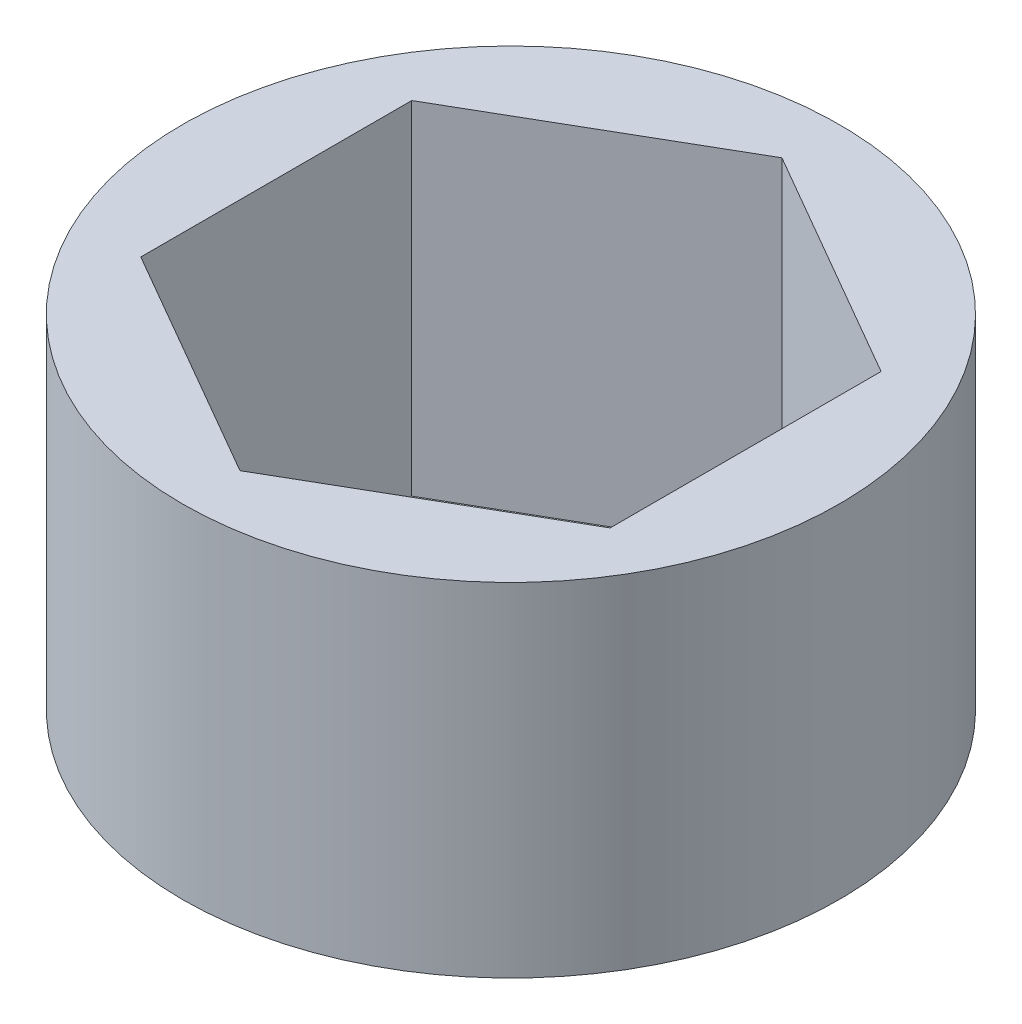
ISO-10303-21;
HEADER;
FILE_DESCRIPTION(('STEP AP214'),'2;1');
FILE_NAME('part.step','',(''),(''),'','','');
FILE_SCHEMA(('AUTOMOTIVE_DESIGN { 1 0 10303 214 1 1 1 1 }'));
ENDSEC;
DATA;
#1=APPLICATION_CONTEXT('core data for automotive mechanical design processes');
#2=APPLICATION_PROTOCOL_DEFINITION('international standard','automotive_design',2000,#1);
#3=PRODUCT_CONTEXT('',#1,'mechanical');
#4=PRODUCT('Part','Part','',(#3));
#5=PRODUCT_RELATED_PRODUCT_CATEGORY('part','',(#4));
#6=PRODUCT_DEFINITION_FORMATION('','',#4);
#7=PRODUCT_DEFINITION_CONTEXT('part definition',#1,'design');
#8=PRODUCT_DEFINITION('design','',#6,#7);
#9=PRODUCT_DEFINITION_SHAPE('','',#8);
#10=(LENGTH_UNIT() NAMED_UNIT(*) SI_UNIT(.MILLI.,.METRE.));
#11=(NAMED_UNIT(*) PLANE_ANGLE_UNIT() SI_UNIT($,.RADIAN.));
#12=(NAMED_UNIT(*) SI_UNIT($,.STERADIAN.) SOLID_ANGLE_UNIT());
#13=UNCERTAINTY_MEASURE_WITH_UNIT(LENGTH_MEASURE(1.E-05),#10,'distance_accuracy_value','');
#14=(GEOMETRIC_REPRESENTATION_CONTEXT(3) GLOBAL_UNCERTAINTY_ASSIGNED_CONTEXT((#13)) GLOBAL_UNIT_ASSIGNED_CONTEXT((#10,
#11,#12)) REPRESENTATION_CONTEXT('',''));
#15=CARTESIAN_POINT('',(0.,0.,0.));
#16=DIRECTION('',(0.,0.,1.));
#17=DIRECTION('',(1.,0.,0.));
#18=AXIS2_PLACEMENT_3D('',#15,#16,#17);
#19=CARTESIAN_POINT('',(0.,4.6355,0.));
#20=DIRECTION('',(0.,1.,0.));
#21=DIRECTION('',(0.,0.,1.));
#22=AXIS2_PLACEMENT_3D('',#19,#20,#21);
#23=PLANE('',#22);
#24=CARTESIAN_POINT('',(0.,4.6355,0.));
#25=DIRECTION('',(0.,1.,0.));
#26=DIRECTION('',(0.,0.,1.));
#27=AXIS2_PLACEMENT_3D('',#24,#25,#26);
#28=CIRCLE('',#27,8.89);
#29=CARTESIAN_POINT('',(0.,4.6355,8.89));
#30=VERTEX_POINT('',#29);
#31=EDGE_CURVE('E11',#30,#30,#28,.T.);
#32=ORIENTED_EDGE('',*,*,#31,.T.);
#33=EDGE_LOOP('',(#32));
#34=FACE_BOUND('',#33,.T.);
#35=DIRECTION('',(-0.866025403784439,0.,0.5));
#36=VECTOR('',#35,1.);
#37=CARTESIAN_POINT('',(0.,4.6355,-7.33234841870824));
#38=LINE('',#37,#36);
#39=CARTESIAN_POINT('',(0.,4.6355,-7.33234841870824));
#40=VERTEX_POINT('',#39);
#41=CARTESIAN_POINT('',(-6.35,4.6355,-3.66617420935412));
#42=VERTEX_POINT('',#41);
#43=EDGE_CURVE('E108',#40,#42,#38,.T.);
#44=ORIENTED_EDGE('',*,*,#43,.F.);
#45=DIRECTION('',(-0.866025403784439,0.,-0.5));
#46=VECTOR('',#45,1.);
#47=CARTESIAN_POINT('',(6.35,4.6355,-3.66617420935412));
#48=LINE('',#47,#46);
#49=CARTESIAN_POINT('',(6.35,4.6355,-3.66617420935412));
#50=VERTEX_POINT('',#49);
#51=EDGE_CURVE('E99',#50,#40,#48,.T.);
#52=ORIENTED_EDGE('',*,*,#51,.F.);
#53=DIRECTION('',(0.,0.,-1.));
#54=VECTOR('',#53,1.);
#55=CARTESIAN_POINT('',(6.34999999999999,4.6355,3.66617420935412));
#56=LINE('',#55,#54);
#57=CARTESIAN_POINT('',(6.34999999999999,4.6355,3.66617420935412));
#58=VERTEX_POINT('',#57);
#59=EDGE_CURVE('E133',#58,#50,#56,.T.);
#60=ORIENTED_EDGE('',*,*,#59,.F.);
#61=DIRECTION('',(0.866025403784439,0.,-0.5));
#62=VECTOR('',#61,1.);
#63=CARTESIAN_POINT('',(0.,4.6355,7.33234841870824));
#64=LINE('',#63,#62);
#65=CARTESIAN_POINT('',(0.,4.6355,7.33234841870824));
#66=VERTEX_POINT('',#65);
#67=EDGE_CURVE('E130',#66,#58,#64,.T.);
#68=ORIENTED_EDGE('',*,*,#67,.F.);
#69=DIRECTION('',(0.866025403784439,0.,0.5));
#70=VECTOR('',#69,1.);
#71=CARTESIAN_POINT('',(-6.35,4.6355,3.66617420935412));
#72=LINE('',#71,#70);
#73=CARTESIAN_POINT('',(-6.35,4.6355,3.66617420935412));
#74=VERTEX_POINT('',#73);
#75=EDGE_CURVE('E125',#74,#66,#72,.T.);
#76=ORIENTED_EDGE('',*,*,#75,.F.);
#77=DIRECTION('',(0.,0.,1.));
#78=VECTOR('',#77,1.);
#79=CARTESIAN_POINT('',(-6.35,4.6355,-3.66617420935412));
#80=LINE('',#79,#78);
#81=EDGE_CURVE('E121',#42,#74,#80,.T.);
#82=ORIENTED_EDGE('',*,*,#81,.F.);
#83=EDGE_LOOP('',(#44,#52,#60,#68,#76,#82));
#84=FACE_BOUND('',#83,.T.);
#85=ADVANCED_FACE('F45',(#34,#84),#23,.T.);
#86=CARTESIAN_POINT('',(0.,-4.6355,0.));
#87=DIRECTION('',(0.,1.,0.));
#88=DIRECTION('',(0.,0.,1.));
#89=AXIS2_PLACEMENT_3D('',#86,#87,#88);
#90=PLANE('',#89);
#91=CARTESIAN_POINT('',(0.,-4.6355,0.));
#92=DIRECTION('',(0.,1.,0.));
#93=DIRECTION('',(0.,0.,1.));
#94=AXIS2_PLACEMENT_3D('',#91,#92,#93);
#95=CIRCLE('',#94,8.89);
#96=CARTESIAN_POINT('',(0.,-4.6355,8.89));
#97=VERTEX_POINT('',#96);
#98=EDGE_CURVE('E49',#97,#97,#95,.T.);
#99=ORIENTED_EDGE('',*,*,#98,.F.);
#100=EDGE_LOOP('',(#99));
#101=FACE_BOUND('',#100,.T.);
#102=DIRECTION('',(-0.866025403784439,0.,-0.5));
#103=VECTOR('',#102,1.);
#104=CARTESIAN_POINT('',(6.35,-4.6355,-3.66617420935412));
#105=LINE('',#104,#103);
#106=CARTESIAN_POINT('',(6.35,-4.6355,-3.66617420935412));
#107=VERTEX_POINT('',#106);
#108=CARTESIAN_POINT('',(0.,-4.6355,-7.33234841870824));
#109=VERTEX_POINT('',#108);
#110=EDGE_CURVE('E69',#107,#109,#105,.T.);
#111=ORIENTED_EDGE('',*,*,#110,.T.);
#112=DIRECTION('',(-0.866025403784439,0.,0.5));
#113=VECTOR('',#112,1.);
#114=CARTESIAN_POINT('',(0.,-4.6355,-7.33234841870824));
#115=LINE('',#114,#113);
#116=CARTESIAN_POINT('',(-6.35,-4.6355,-3.66617420935412));
#117=VERTEX_POINT('',#116);
#118=EDGE_CURVE('E115',#109,#117,#115,.T.);
#119=ORIENTED_EDGE('',*,*,#118,.T.);
#120=DIRECTION('',(0.,0.,1.));
#121=VECTOR('',#120,1.);
#122=CARTESIAN_POINT('',(-6.35,-4.6355,-3.66617420935412));
#123=LINE('',#122,#121);
#124=CARTESIAN_POINT('',(-6.35,-4.6355,3.66617420935412));
#125=VERTEX_POINT('',#124);
#126=EDGE_CURVE('E140',#117,#125,#123,.T.);
#127=ORIENTED_EDGE('',*,*,#126,.T.);
#128=DIRECTION('',(0.866025403784439,0.,0.5));
#129=VECTOR('',#128,1.);
#130=CARTESIAN_POINT('',(-6.35,-4.6355,3.66617420935412));
#131=LINE('',#130,#129);
#132=CARTESIAN_POINT('',(0.,-4.6355,7.33234841870824));
#133=VERTEX_POINT('',#132);
#134=EDGE_CURVE('E144',#125,#133,#131,.T.);
#135=ORIENTED_EDGE('',*,*,#134,.T.);
#136=DIRECTION('',(0.866025403784439,0.,-0.5));
#137=VECTOR('',#136,1.);
#138=CARTESIAN_POINT('',(0.,-4.6355,7.33234841870824));
#139=LINE('',#138,#137);
#140=CARTESIAN_POINT('',(6.34999999999999,-4.6355,3.66617420935412));
#141=VERTEX_POINT('',#140);
#142=EDGE_CURVE('E148',#133,#141,#139,.T.);
#143=ORIENTED_EDGE('',*,*,#142,.T.);
#144=DIRECTION('',(0.,0.,-1.));
#145=VECTOR('',#144,1.);
#146=CARTESIAN_POINT('',(6.34999999999999,-4.6355,3.66617420935412));
#147=LINE('',#146,#145);
#148=EDGE_CURVE('E109',#141,#107,#147,.T.);
#149=ORIENTED_EDGE('',*,*,#148,.T.);
#150=EDGE_LOOP('',(#111,#119,#127,#135,#143,#149));
#151=FACE_BOUND('',#150,.T.);
#152=ADVANCED_FACE('F172',(#101,#151),#90,.F.);
#153=CARTESIAN_POINT('',(0.,4.6355,0.));
#154=DIRECTION('',(0.,-1.,0.));
#155=DIRECTION('',(0.,0.,-1.));
#156=AXIS2_PLACEMENT_3D('',#153,#154,#155);
#157=CYLINDRICAL_SURFACE('',#156,8.89);
#158=ORIENTED_EDGE('',*,*,#31,.F.);
#159=EDGE_LOOP('',(#158));
#160=FACE_BOUND('',#159,.T.);
#161=ORIENTED_EDGE('',*,*,#98,.T.);
#162=EDGE_LOOP('',(#161));
#163=FACE_BOUND('',#162,.T.);
#164=ADVANCED_FACE('F47',(#160,#163),#157,.T.);
#165=CARTESIAN_POINT('',(6.35,4.6355,-3.66617420935412));
#166=DIRECTION('',(-0.5,0.,0.866025403784439));
#167=DIRECTION('',(0.866025403784439,0.,0.5));
#168=AXIS2_PLACEMENT_3D('',#165,#166,#167);
#169=PLANE('',#168);
#170=ORIENTED_EDGE('',*,*,#110,.F.);
#171=DIRECTION('',(0.,-1.,0.));
#172=VECTOR('',#171,1.);
#173=CARTESIAN_POINT('',(6.35,4.6355,-3.66617420935412));
#174=LINE('',#173,#172);
#175=EDGE_CURVE('E103',#50,#107,#174,.T.);
#176=ORIENTED_EDGE('',*,*,#175,.F.);
#177=ORIENTED_EDGE('',*,*,#51,.T.);
#178=DIRECTION('',(0.,-1.,0.));
#179=VECTOR('',#178,1.);
#180=CARTESIAN_POINT('',(0.,4.6355,-7.33234841870824));
#181=LINE('',#180,#179);
#182=EDGE_CURVE('E102',#40,#109,#181,.T.);
#183=ORIENTED_EDGE('',*,*,#182,.T.);
#184=EDGE_LOOP('',(#170,#176,#177,#183));
#185=FACE_BOUND('',#184,.T.);
#186=ADVANCED_FACE('F101',(#185),#169,.T.);
#187=CARTESIAN_POINT('',(0.,4.6355,-7.33234841870824));
#188=DIRECTION('',(0.5,0.,0.866025403784439));
#189=DIRECTION('',(0.866025403784439,0.,-0.5));
#190=AXIS2_PLACEMENT_3D('',#187,#188,#189);
#191=PLANE('',#190);
#192=ORIENTED_EDGE('',*,*,#118,.F.);
#193=ORIENTED_EDGE('',*,*,#182,.F.);
#194=ORIENTED_EDGE('',*,*,#43,.T.);
#195=DIRECTION('',(0.,-1.,0.));
#196=VECTOR('',#195,1.);
#197=CARTESIAN_POINT('',(-6.35,4.6355,-3.66617420935412));
#198=LINE('',#197,#196);
#199=EDGE_CURVE('E117',#42,#117,#198,.T.);
#200=ORIENTED_EDGE('',*,*,#199,.T.);
#201=EDGE_LOOP('',(#192,#193,#194,#200));
#202=FACE_BOUND('',#201,.T.);
#203=ADVANCED_FACE('F112',(#202),#191,.T.);
#204=CARTESIAN_POINT('',(-6.35,4.6355,-3.66617420935412));
#205=DIRECTION('',(1.,0.,0.));
#206=DIRECTION('',(0.,0.,-1.));
#207=AXIS2_PLACEMENT_3D('',#204,#205,#206);
#208=PLANE('',#207);
#209=ORIENTED_EDGE('',*,*,#126,.F.);
#210=ORIENTED_EDGE('',*,*,#199,.F.);
#211=ORIENTED_EDGE('',*,*,#81,.T.);
#212=DIRECTION('',(0.,-1.,0.));
#213=VECTOR('',#212,1.);
#214=CARTESIAN_POINT('',(-6.35,4.6355,3.66617420935412));
#215=LINE('',#214,#213);
#216=EDGE_CURVE('E162',#74,#125,#215,.T.);
#217=ORIENTED_EDGE('',*,*,#216,.T.);
#218=EDGE_LOOP('',(#209,#210,#211,#217));
#219=FACE_BOUND('',#218,.T.);
#220=ADVANCED_FACE('F168',(#219),#208,.T.);
#221=CARTESIAN_POINT('',(-6.35,4.6355,3.66617420935412));
#222=DIRECTION('',(0.5,0.,-0.866025403784439));
#223=DIRECTION('',(-0.866025403784439,0.,-0.5));
#224=AXIS2_PLACEMENT_3D('',#221,#222,#223);
#225=PLANE('',#224);
#226=ORIENTED_EDGE('',*,*,#134,.F.);
#227=ORIENTED_EDGE('',*,*,#216,.F.);
#228=ORIENTED_EDGE('',*,*,#75,.T.);
#229=DIRECTION('',(0.,-1.,0.));
#230=VECTOR('',#229,1.);
#231=CARTESIAN_POINT('',(0.,4.6355,7.33234841870824));
#232=LINE('',#231,#230);
#233=EDGE_CURVE('E159',#66,#133,#232,.T.);
#234=ORIENTED_EDGE('',*,*,#233,.T.);
#235=EDGE_LOOP('',(#226,#227,#228,#234));
#236=FACE_BOUND('',#235,.T.);
#237=ADVANCED_FACE('F180',(#236),#225,.T.);
#238=CARTESIAN_POINT('',(0.,4.6355,7.33234841870824));
#239=DIRECTION('',(-0.5,0.,-0.866025403784439));
#240=DIRECTION('',(-0.866025403784439,0.,0.5));
#241=AXIS2_PLACEMENT_3D('',#238,#239,#240);
#242=PLANE('',#241);
#243=ORIENTED_EDGE('',*,*,#142,.F.);
#244=ORIENTED_EDGE('',*,*,#233,.F.);
#245=ORIENTED_EDGE('',*,*,#67,.T.);
#246=DIRECTION('',(0.,-1.,0.));
#247=VECTOR('',#246,1.);
#248=CARTESIAN_POINT('',(6.34999999999999,4.6355,3.66617420935412));
#249=LINE('',#248,#247);
#250=EDGE_CURVE('E61',#58,#141,#249,.T.);
#251=ORIENTED_EDGE('',*,*,#250,.T.);
#252=EDGE_LOOP('',(#243,#244,#245,#251));
#253=FACE_BOUND('',#252,.T.);
#254=ADVANCED_FACE('F178',(#253),#242,.T.);
#255=CARTESIAN_POINT('',(6.34999999999999,4.6355,3.66617420935412));
#256=DIRECTION('',(-1.,0.,0.));
#257=DIRECTION('',(0.,0.,1.));
#258=AXIS2_PLACEMENT_3D('',#255,#256,#257);
#259=PLANE('',#258);
#260=ORIENTED_EDGE('',*,*,#148,.F.);
#261=ORIENTED_EDGE('',*,*,#250,.F.);
#262=ORIENTED_EDGE('',*,*,#59,.T.);
#263=ORIENTED_EDGE('',*,*,#175,.T.);
#264=EDGE_LOOP('',(#260,#261,#262,#263));
#265=FACE_BOUND('',#264,.T.);
#266=ADVANCED_FACE('F174',(#265),#259,.T.);
#267=CLOSED_SHELL('',(#85,#152,#164,#186,#203,#220,#237,#254,#266));
#268=MANIFOLD_SOLID_BREP('B2',#267);
#269=ADVANCED_BREP_SHAPE_REPRESENTATION('',(#18,#268),#14);
#270=SHAPE_DEFINITION_REPRESENTATION(#9,#269);
ENDSEC;
END-ISO-10303-21;
